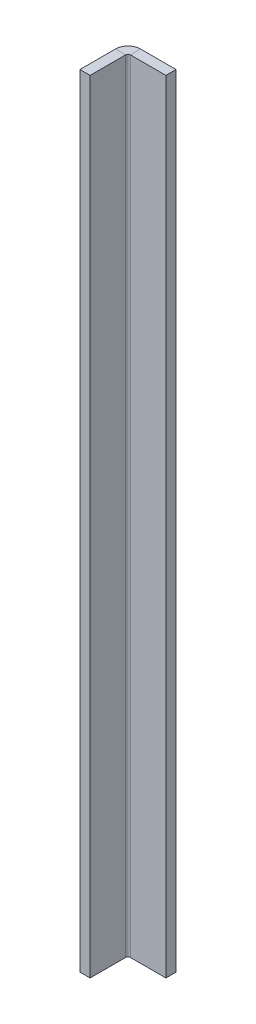
ISO-10303-21;
HEADER;
FILE_DESCRIPTION(('STEP AP214'),'2;1');
FILE_NAME('part.step','',(''),(''),'','','');
FILE_SCHEMA(('AUTOMOTIVE_DESIGN { 1 0 10303 214 1 1 1 1 }'));
ENDSEC;
DATA;
#1=APPLICATION_CONTEXT('core data for automotive mechanical design processes');
#2=APPLICATION_PROTOCOL_DEFINITION('international standard','automotive_design',2000,#1);
#3=PRODUCT_CONTEXT('',#1,'mechanical');
#4=PRODUCT('Part','Part','',(#3));
#5=PRODUCT_RELATED_PRODUCT_CATEGORY('part','',(#4));
#6=PRODUCT_DEFINITION_FORMATION('','',#4);
#7=PRODUCT_DEFINITION_CONTEXT('part definition',#1,'design');
#8=PRODUCT_DEFINITION('design','',#6,#7);
#9=PRODUCT_DEFINITION_SHAPE('','',#8);
#10=(LENGTH_UNIT() NAMED_UNIT(*) SI_UNIT(.MILLI.,.METRE.));
#11=(NAMED_UNIT(*) PLANE_ANGLE_UNIT() SI_UNIT($,.RADIAN.));
#12=(NAMED_UNIT(*) SI_UNIT($,.STERADIAN.) SOLID_ANGLE_UNIT());
#13=UNCERTAINTY_MEASURE_WITH_UNIT(LENGTH_MEASURE(1.E-05),#10,'distance_accuracy_value','');
#14=(GEOMETRIC_REPRESENTATION_CONTEXT(3) GLOBAL_UNCERTAINTY_ASSIGNED_CONTEXT((#13)) GLOBAL_UNIT_ASSIGNED_CONTEXT((#10,
#11,#12)) REPRESENTATION_CONTEXT('',''));
#15=CARTESIAN_POINT('',(0.,0.,0.));
#16=DIRECTION('',(0.,0.,1.));
#17=DIRECTION('',(1.,0.,0.));
#18=AXIS2_PLACEMENT_3D('',#15,#16,#17);
#19=CARTESIAN_POINT('',(15.,-122.,-3.175));
#20=DIRECTION('',(0.,0.,1.));
#21=DIRECTION('',(0.,-1.,0.));
#22=AXIS2_PLACEMENT_3D('',#19,#20,#21);
#23=PLANE('',#22);
#24=DIRECTION('',(0.,-1.,0.));
#25=VECTOR('',#24,1.);
#26=CARTESIAN_POINT('',(3.91159999999999,-122.,-3.17500000000003));
#27=LINE('',#26,#25);
#28=CARTESIAN_POINT('',(3.91159999999999,-122.,-3.17500000000003));
#29=VERTEX_POINT('',#28);
#30=CARTESIAN_POINT('',(3.91159999999999,122.,-3.17499999999996));
#31=VERTEX_POINT('',#30);
#32=EDGE_CURVE('E164',#29,#31,#27,.F.);
#33=ORIENTED_EDGE('',*,*,#32,.T.);
#34=DIRECTION('',(-1.,0.,0.));
#35=VECTOR('',#34,1.);
#36=CARTESIAN_POINT('',(15.,122.,-3.17499999999996));
#37=LINE('',#36,#35);
#38=CARTESIAN_POINT('',(15.,122.,-3.17499999999996));
#39=VERTEX_POINT('',#38);
#40=EDGE_CURVE('E13',#39,#31,#37,.T.);
#41=ORIENTED_EDGE('',*,*,#40,.F.);
#42=DIRECTION('',(0.,1.,0.));
#43=VECTOR('',#42,1.);
#44=CARTESIAN_POINT('',(15.,-122.,-3.175));
#45=LINE('',#44,#43);
#46=CARTESIAN_POINT('',(15.,-122.,-3.175));
#47=VERTEX_POINT('',#46);
#48=EDGE_CURVE('E185',#47,#39,#45,.T.);
#49=ORIENTED_EDGE('',*,*,#48,.F.);
#50=DIRECTION('',(-1.,0.,0.));
#51=VECTOR('',#50,1.);
#52=CARTESIAN_POINT('',(15.,-122.,-3.175));
#53=LINE('',#52,#51);
#54=EDGE_CURVE('E70',#47,#29,#53,.T.);
#55=ORIENTED_EDGE('',*,*,#54,.T.);
#56=EDGE_LOOP('',(#33,#41,#49,#55));
#57=FACE_BOUND('',#56,.T.);
#58=ADVANCED_FACE('F56',(#57),#23,.F.);
#59=CARTESIAN_POINT('',(15.,-122.,0.));
#60=DIRECTION('',(0.,0.,1.));
#61=DIRECTION('',(0.,-1.,0.));
#62=AXIS2_PLACEMENT_3D('',#59,#60,#61);
#63=PLANE('',#62);
#64=DIRECTION('',(-1.,0.,0.));
#65=VECTOR('',#64,1.);
#66=CARTESIAN_POINT('',(15.,122.,0.));
#67=LINE('',#66,#65);
#68=CARTESIAN_POINT('',(15.,122.,0.));
#69=VERTEX_POINT('',#68);
#70=CARTESIAN_POINT('',(3.91159999999999,122.,0.));
#71=VERTEX_POINT('',#70);
#72=EDGE_CURVE('E63',#69,#71,#67,.T.);
#73=ORIENTED_EDGE('',*,*,#72,.T.);
#74=DIRECTION('',(0.,-1.,0.));
#75=VECTOR('',#74,1.);
#76=CARTESIAN_POINT('',(3.91159999999999,-122.,0.));
#77=LINE('',#76,#75);
#78=CARTESIAN_POINT('',(3.91159999999999,-122.,0.));
#79=VERTEX_POINT('',#78);
#80=EDGE_CURVE('E176',#79,#71,#77,.F.);
#81=ORIENTED_EDGE('',*,*,#80,.F.);
#82=DIRECTION('',(-1.,0.,0.));
#83=VECTOR('',#82,1.);
#84=CARTESIAN_POINT('',(15.,-122.,0.));
#85=LINE('',#84,#83);
#86=CARTESIAN_POINT('',(15.,-122.,0.));
#87=VERTEX_POINT('',#86);
#88=EDGE_CURVE('E78',#87,#79,#85,.T.);
#89=ORIENTED_EDGE('',*,*,#88,.F.);
#90=DIRECTION('',(0.,1.,0.));
#91=VECTOR('',#90,1.);
#92=CARTESIAN_POINT('',(15.,-122.,0.));
#93=LINE('',#92,#91);
#94=EDGE_CURVE('E191',#87,#69,#93,.T.);
#95=ORIENTED_EDGE('',*,*,#94,.T.);
#96=EDGE_LOOP('',(#73,#81,#89,#95));
#97=FACE_BOUND('',#96,.T.);
#98=ADVANCED_FACE('F197',(#97),#63,.T.);
#99=CARTESIAN_POINT('',(15.,-122.,-3.175));
#100=DIRECTION('',(0.,-1.,0.));
#101=DIRECTION('',(0.,0.,-1.));
#102=AXIS2_PLACEMENT_3D('',#99,#100,#101);
#103=PLANE('',#102);
#104=ORIENTED_EDGE('',*,*,#88,.T.);
#105=DIRECTION('',(0.,0.,-1.));
#106=VECTOR('',#105,1.);
#107=CARTESIAN_POINT('',(3.91159999999999,-122.,0.));
#108=LINE('',#107,#106);
#109=EDGE_CURVE('E170',#79,#29,#108,.T.);
#110=ORIENTED_EDGE('',*,*,#109,.T.);
#111=ORIENTED_EDGE('',*,*,#54,.F.);
#112=DIRECTION('',(0.,0.,1.));
#113=VECTOR('',#112,1.);
#114=CARTESIAN_POINT('',(15.,-122.,-3.175));
#115=LINE('',#114,#113);
#116=EDGE_CURVE('E193',#47,#87,#115,.T.);
#117=ORIENTED_EDGE('',*,*,#116,.T.);
#118=EDGE_LOOP('',(#104,#110,#111,#117));
#119=FACE_BOUND('',#118,.T.);
#120=ADVANCED_FACE('F220',(#119),#103,.T.);
#121=CARTESIAN_POINT('',(15.,122.,0.));
#122=DIRECTION('',(0.,1.,0.));
#123=DIRECTION('',(0.,0.,1.));
#124=AXIS2_PLACEMENT_3D('',#121,#122,#123);
#125=PLANE('',#124);
#126=DIRECTION('',(0.,0.,-1.));
#127=VECTOR('',#126,1.);
#128=CARTESIAN_POINT('',(3.91159999999999,122.,0.));
#129=LINE('',#128,#127);
#130=EDGE_CURVE('E182',#71,#31,#129,.T.);
#131=ORIENTED_EDGE('',*,*,#130,.F.);
#132=ORIENTED_EDGE('',*,*,#72,.F.);
#133=DIRECTION('',(0.,0.,-1.));
#134=VECTOR('',#133,1.);
#135=CARTESIAN_POINT('',(15.,122.,0.));
#136=LINE('',#135,#134);
#137=EDGE_CURVE('E188',#69,#39,#136,.T.);
#138=ORIENTED_EDGE('',*,*,#137,.T.);
#139=ORIENTED_EDGE('',*,*,#40,.T.);
#140=EDGE_LOOP('',(#131,#132,#138,#139));
#141=FACE_BOUND('',#140,.T.);
#142=ADVANCED_FACE('F225',(#141),#125,.T.);
#143=CARTESIAN_POINT('',(15.,0.,0.));
#144=DIRECTION('',(-1.,0.,0.));
#145=DIRECTION('',(0.,0.,1.));
#146=AXIS2_PLACEMENT_3D('',#143,#144,#145);
#147=PLANE('',#146);
#148=ORIENTED_EDGE('',*,*,#48,.T.);
#149=ORIENTED_EDGE('',*,*,#137,.F.);
#150=ORIENTED_EDGE('',*,*,#94,.F.);
#151=ORIENTED_EDGE('',*,*,#116,.F.);
#152=EDGE_LOOP('',(#148,#149,#150,#151));
#153=FACE_BOUND('',#152,.T.);
#154=ADVANCED_FACE('F223',(#153),#147,.F.);
#155=CARTESIAN_POINT('',(3.91159999999999,122.,0.736600000000027));
#156=DIRECTION('',(0.,1.,0.));
#157=DIRECTION('',(0.,0.,1.));
#158=AXIS2_PLACEMENT_3D('',#155,#156,#157);
#159=PLANE('',#158);
#160=DIRECTION('',(1.,0.,0.));
#161=VECTOR('',#160,1.);
#162=CARTESIAN_POINT('',(0.,122.,0.736600000000009));
#163=LINE('',#162,#161);
#164=CARTESIAN_POINT('',(3.17499999999999,122.,0.736600000000024));
#165=VERTEX_POINT('',#164);
#166=CARTESIAN_POINT('',(0.,122.,0.736600000000013));
#167=VERTEX_POINT('',#166);
#168=EDGE_CURVE('E146',#165,#167,#163,.F.);
#169=ORIENTED_EDGE('',*,*,#168,.F.);
#170=CARTESIAN_POINT('',(3.91159999999999,122.,0.736600000000027));
#171=DIRECTION('',(0.,-1.,0.));
#172=DIRECTION('',(0.,0.,-1.));
#173=AXIS2_PLACEMENT_3D('',#170,#171,#172);
#174=CIRCLE('',#173,0.7366);
#175=EDGE_CURVE('E173',#71,#165,#174,.F.);
#176=ORIENTED_EDGE('',*,*,#175,.F.);
#177=ORIENTED_EDGE('',*,*,#130,.T.);
#178=CARTESIAN_POINT('',(3.91159999999999,122.,0.736600000000027));
#179=DIRECTION('',(0.,-1.,0.));
#180=DIRECTION('',(0.,0.,-1.));
#181=AXIS2_PLACEMENT_3D('',#178,#179,#180);
#182=CIRCLE('',#181,3.9116);
#183=EDGE_CURVE('E166',#31,#167,#182,.F.);
#184=ORIENTED_EDGE('',*,*,#183,.T.);
#185=EDGE_LOOP('',(#169,#176,#177,#184));
#186=FACE_BOUND('',#185,.T.);
#187=ADVANCED_FACE('F206',(#186),#159,.T.);
#188=CARTESIAN_POINT('',(3.91159999999999,-122.,0.736599999999973));
#189=DIRECTION('',(0.,1.,0.));
#190=DIRECTION('',(0.,0.,1.));
#191=AXIS2_PLACEMENT_3D('',#188,#189,#190);
#192=PLANE('',#191);
#193=CARTESIAN_POINT('',(3.91159999999999,-122.,0.736599999999973));
#194=DIRECTION('',(0.,-1.,0.));
#195=DIRECTION('',(0.,0.,-1.));
#196=AXIS2_PLACEMENT_3D('',#193,#194,#195);
#197=CIRCLE('',#196,0.7366);
#198=CARTESIAN_POINT('',(3.17499999999999,-122.,0.73659999999997));
#199=VERTEX_POINT('',#198);
#200=EDGE_CURVE('E179',#199,#79,#197,.T.);
#201=ORIENTED_EDGE('',*,*,#200,.F.);
#202=DIRECTION('',(1.,0.,0.));
#203=VECTOR('',#202,1.);
#204=CARTESIAN_POINT('',(3.17499999999997,-122.,0.736599999999975));
#205=LINE('',#204,#203);
#206=CARTESIAN_POINT('',(0.,-122.,0.736599999999964));
#207=VERTEX_POINT('',#206);
#208=EDGE_CURVE('E158',#199,#207,#205,.F.);
#209=ORIENTED_EDGE('',*,*,#208,.T.);
#210=CARTESIAN_POINT('',(3.91159999999999,-122.,0.736599999999973));
#211=DIRECTION('',(0.,-1.,0.));
#212=DIRECTION('',(0.,0.,-1.));
#213=AXIS2_PLACEMENT_3D('',#210,#211,#212);
#214=CIRCLE('',#213,3.9116);
#215=EDGE_CURVE('E167',#207,#29,#214,.T.);
#216=ORIENTED_EDGE('',*,*,#215,.T.);
#217=ORIENTED_EDGE('',*,*,#109,.F.);
#218=EDGE_LOOP('',(#201,#209,#216,#217));
#219=FACE_BOUND('',#218,.T.);
#220=ADVANCED_FACE('F219',(#219),#192,.F.);
#221=CARTESIAN_POINT('',(3.91159999999999,-122.,0.736599999999973));
#222=DIRECTION('',(0.,-1.,0.));
#223=DIRECTION('',(-1.,0.,0.));
#224=AXIS2_PLACEMENT_3D('',#221,#222,#223);
#225=CYLINDRICAL_SURFACE('',#224,3.9116);
#226=ORIENTED_EDGE('',*,*,#32,.F.);
#227=ORIENTED_EDGE('',*,*,#215,.F.);
#228=DIRECTION('',(0.,-1.,0.));
#229=VECTOR('',#228,1.);
#230=CARTESIAN_POINT('',(0.,122.,0.736600000000009));
#231=LINE('',#230,#229);
#232=EDGE_CURVE('E156',#207,#167,#231,.F.);
#233=ORIENTED_EDGE('',*,*,#232,.T.);
#234=ORIENTED_EDGE('',*,*,#183,.F.);
#235=EDGE_LOOP('',(#226,#227,#233,#234));
#236=FACE_BOUND('',#235,.T.);
#237=ADVANCED_FACE('F210',(#236),#225,.T.);
#238=CARTESIAN_POINT('',(3.91159999999999,-122.,0.736599999999973));
#239=DIRECTION('',(0.,-1.,0.));
#240=DIRECTION('',(-1.,0.,0.));
#241=AXIS2_PLACEMENT_3D('',#238,#239,#240);
#242=CYLINDRICAL_SURFACE('',#241,0.7366);
#243=ORIENTED_EDGE('',*,*,#80,.T.);
#244=ORIENTED_EDGE('',*,*,#175,.T.);
#245=DIRECTION('',(0.,-1.,0.));
#246=VECTOR('',#245,1.);
#247=CARTESIAN_POINT('',(3.17499999999997,122.,0.73660000000002));
#248=LINE('',#247,#246);
#249=EDGE_CURVE('E161',#165,#199,#248,.T.);
#250=ORIENTED_EDGE('',*,*,#249,.T.);
#251=ORIENTED_EDGE('',*,*,#200,.T.);
#252=EDGE_LOOP('',(#243,#244,#250,#251));
#253=FACE_BOUND('',#252,.T.);
#254=ADVANCED_FACE('F202',(#253),#242,.F.);
#255=CARTESIAN_POINT('',(0.,-122.,11.825));
#256=DIRECTION('',(0.,1.,0.));
#257=DIRECTION('',(-1.,0.,0.));
#258=AXIS2_PLACEMENT_3D('',#255,#256,#257);
#259=PLANE('',#258);
#260=ORIENTED_EDGE('',*,*,#208,.F.);
#261=DIRECTION('',(0.,0.,-1.));
#262=VECTOR('',#261,1.);
#263=CARTESIAN_POINT('',(3.17499999999996,-122.,11.825));
#264=LINE('',#263,#262);
#265=CARTESIAN_POINT('',(3.17499999999996,-122.,11.825));
#266=VERTEX_POINT('',#265);
#267=EDGE_CURVE('E154',#199,#266,#264,.F.);
#268=ORIENTED_EDGE('',*,*,#267,.T.);
#269=DIRECTION('',(1.,0.,0.));
#270=VECTOR('',#269,1.);
#271=CARTESIAN_POINT('',(0.,-122.,11.825));
#272=LINE('',#271,#270);
#273=CARTESIAN_POINT('',(0.,-122.,11.825));
#274=VERTEX_POINT('',#273);
#275=EDGE_CURVE('E142',#274,#266,#272,.T.);
#276=ORIENTED_EDGE('',*,*,#275,.F.);
#277=DIRECTION('',(0.,0.,1.));
#278=VECTOR('',#277,1.);
#279=CARTESIAN_POINT('',(0.,-122.,0.));
#280=LINE('',#279,#278);
#281=EDGE_CURVE('E129',#207,#274,#280,.T.);
#282=ORIENTED_EDGE('',*,*,#281,.F.);
#283=EDGE_LOOP('',(#260,#268,#276,#282));
#284=FACE_BOUND('',#283,.T.);
#285=ADVANCED_FACE('F213',(#284),#259,.F.);
#286=CARTESIAN_POINT('',(0.,122.,0.));
#287=DIRECTION('',(0.,-1.,0.));
#288=DIRECTION('',(1.,0.,0.));
#289=AXIS2_PLACEMENT_3D('',#286,#287,#288);
#290=PLANE('',#289);
#291=ORIENTED_EDGE('',*,*,#168,.T.);
#292=DIRECTION('',(0.,0.,-1.));
#293=VECTOR('',#292,1.);
#294=CARTESIAN_POINT('',(0.,122.,0.));
#295=LINE('',#294,#293);
#296=CARTESIAN_POINT('',(0.,122.,11.825));
#297=VERTEX_POINT('',#296);
#298=EDGE_CURVE('E127',#297,#167,#295,.T.);
#299=ORIENTED_EDGE('',*,*,#298,.F.);
#300=DIRECTION('',(1.,0.,0.));
#301=VECTOR('',#300,1.);
#302=CARTESIAN_POINT('',(0.,122.,11.825));
#303=LINE('',#302,#301);
#304=CARTESIAN_POINT('',(3.17499999999996,122.,11.825));
#305=VERTEX_POINT('',#304);
#306=EDGE_CURVE('E135',#297,#305,#303,.T.);
#307=ORIENTED_EDGE('',*,*,#306,.T.);
#308=DIRECTION('',(0.,0.,1.));
#309=VECTOR('',#308,1.);
#310=CARTESIAN_POINT('',(3.175,122.,0.));
#311=LINE('',#310,#309);
#312=EDGE_CURVE('E151',#305,#165,#311,.F.);
#313=ORIENTED_EDGE('',*,*,#312,.T.);
#314=EDGE_LOOP('',(#291,#299,#307,#313));
#315=FACE_BOUND('',#314,.T.);
#316=ADVANCED_FACE('F145',(#315),#290,.F.);
#317=CARTESIAN_POINT('',(0.,0.,0.));
#318=DIRECTION('',(1.,0.,0.));
#319=DIRECTION('',(0.,0.,-1.));
#320=AXIS2_PLACEMENT_3D('',#317,#318,#319);
#321=PLANE('',#320);
#322=ORIENTED_EDGE('',*,*,#232,.F.);
#323=ORIENTED_EDGE('',*,*,#281,.T.);
#324=DIRECTION('',(0.,1.,0.));
#325=VECTOR('',#324,1.);
#326=CARTESIAN_POINT('',(0.,0.,11.825));
#327=LINE('',#326,#325);
#328=EDGE_CURVE('E122',#274,#297,#327,.T.);
#329=ORIENTED_EDGE('',*,*,#328,.T.);
#330=ORIENTED_EDGE('',*,*,#298,.T.);
#331=EDGE_LOOP('',(#322,#323,#329,#330));
#332=FACE_BOUND('',#331,.T.);
#333=ADVANCED_FACE('F125',(#332),#321,.F.);
#334=CARTESIAN_POINT('',(3.175,0.,0.));
#335=DIRECTION('',(1.,0.,0.));
#336=DIRECTION('',(0.,0.,-1.));
#337=AXIS2_PLACEMENT_3D('',#334,#335,#336);
#338=PLANE('',#337);
#339=ORIENTED_EDGE('',*,*,#267,.F.);
#340=ORIENTED_EDGE('',*,*,#249,.F.);
#341=ORIENTED_EDGE('',*,*,#312,.F.);
#342=DIRECTION('',(0.,-1.,0.));
#343=VECTOR('',#342,1.);
#344=CARTESIAN_POINT('',(3.17499999999996,122.,11.825));
#345=LINE('',#344,#343);
#346=EDGE_CURVE('E138',#266,#305,#345,.F.);
#347=ORIENTED_EDGE('',*,*,#346,.F.);
#348=EDGE_LOOP('',(#339,#340,#341,#347));
#349=FACE_BOUND('',#348,.T.);
#350=ADVANCED_FACE('F216',(#349),#338,.T.);
#351=CARTESIAN_POINT('',(0.,122.,11.825));
#352=DIRECTION('',(0.,0.,-1.));
#353=DIRECTION('',(-1.,0.,0.));
#354=AXIS2_PLACEMENT_3D('',#351,#352,#353);
#355=PLANE('',#354);
#356=ORIENTED_EDGE('',*,*,#346,.T.);
#357=ORIENTED_EDGE('',*,*,#306,.F.);
#358=ORIENTED_EDGE('',*,*,#328,.F.);
#359=ORIENTED_EDGE('',*,*,#275,.T.);
#360=EDGE_LOOP('',(#356,#357,#358,#359));
#361=FACE_BOUND('',#360,.T.);
#362=ADVANCED_FACE('F136',(#361),#355,.F.);
#363=CLOSED_SHELL('',(#58,#98,#120,#142,#154,#187,#220,#237,#254,#285,#316,#333,#350,#362));
#364=MANIFOLD_SOLID_BREP('B2',#363);
#365=ADVANCED_BREP_SHAPE_REPRESENTATION('',(#18,#364),#14);
#366=SHAPE_DEFINITION_REPRESENTATION(#9,#365);
ENDSEC;
END-ISO-10303-21;
